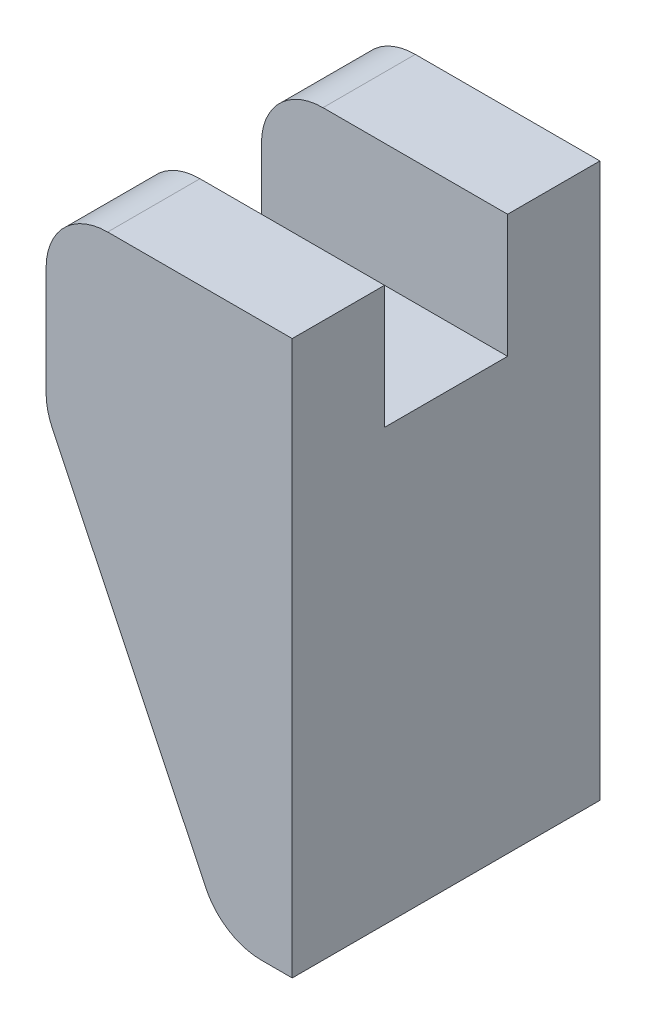
ISO-10303-21;
HEADER;
FILE_DESCRIPTION(('STEP AP214'),'2;1');
FILE_NAME('part.step','',(''),(''),'','','');
FILE_SCHEMA(('AUTOMOTIVE_DESIGN { 1 0 10303 214 1 1 1 1 }'));
ENDSEC;
DATA;
#1=APPLICATION_CONTEXT('core data for automotive mechanical design processes');
#2=APPLICATION_PROTOCOL_DEFINITION('international standard','automotive_design',2000,#1);
#3=PRODUCT_CONTEXT('',#1,'mechanical');
#4=PRODUCT('Part','Part','',(#3));
#5=PRODUCT_RELATED_PRODUCT_CATEGORY('part','',(#4));
#6=PRODUCT_DEFINITION_FORMATION('','',#4);
#7=PRODUCT_DEFINITION_CONTEXT('part definition',#1,'design');
#8=PRODUCT_DEFINITION('design','',#6,#7);
#9=PRODUCT_DEFINITION_SHAPE('','',#8);
#10=(LENGTH_UNIT() NAMED_UNIT(*) SI_UNIT(.MILLI.,.METRE.));
#11=(NAMED_UNIT(*) PLANE_ANGLE_UNIT() SI_UNIT($,.RADIAN.));
#12=(NAMED_UNIT(*) SI_UNIT($,.STERADIAN.) SOLID_ANGLE_UNIT());
#13=UNCERTAINTY_MEASURE_WITH_UNIT(LENGTH_MEASURE(1.E-05),#10,'distance_accuracy_value','');
#14=(GEOMETRIC_REPRESENTATION_CONTEXT(3) GLOBAL_UNCERTAINTY_ASSIGNED_CONTEXT((#13)) GLOBAL_UNIT_ASSIGNED_CONTEXT((#10,
#11,#12)) REPRESENTATION_CONTEXT('',''));
#15=CARTESIAN_POINT('',(0.,0.,0.));
#16=DIRECTION('',(0.,0.,1.));
#17=DIRECTION('',(1.,0.,0.));
#18=AXIS2_PLACEMENT_3D('',#15,#16,#17);
#19=CARTESIAN_POINT('',(0.,45.,25.));
#20=DIRECTION('',(0.,-1.,0.));
#21=DIRECTION('',(1.,0.,0.));
#22=AXIS2_PLACEMENT_3D('',#19,#20,#21);
#23=PLANE('',#22);
#24=DIRECTION('',(1.,0.,0.));
#25=VECTOR('',#24,1.);
#26=CARTESIAN_POINT('',(-40.,45.,10.));
#27=LINE('',#26,#25);
#28=CARTESIAN_POINT('',(-30.,45.,10.));
#29=VERTEX_POINT('',#28);
#30=CARTESIAN_POINT('',(0.,45.,10.));
#31=VERTEX_POINT('',#30);
#32=EDGE_CURVE('E157',#29,#31,#27,.T.);
#33=ORIENTED_EDGE('',*,*,#32,.F.);
#34=DIRECTION('',(0.,0.,-1.));
#35=VECTOR('',#34,1.);
#36=CARTESIAN_POINT('',(-30.,45.,25.));
#37=LINE('',#36,#35);
#38=CARTESIAN_POINT('',(-30.,45.,25.));
#39=VERTEX_POINT('',#38);
#40=EDGE_CURVE('E207',#29,#39,#37,.F.);
#41=ORIENTED_EDGE('',*,*,#40,.T.);
#42=DIRECTION('',(-1.,0.,0.));
#43=VECTOR('',#42,1.);
#44=CARTESIAN_POINT('',(0.,45.,25.));
#45=LINE('',#44,#43);
#46=CARTESIAN_POINT('',(0.,45.,25.));
#47=VERTEX_POINT('',#46);
#48=EDGE_CURVE('E172',#47,#39,#45,.T.);
#49=ORIENTED_EDGE('',*,*,#48,.F.);
#50=DIRECTION('',(0.,0.,-1.));
#51=VECTOR('',#50,1.);
#52=CARTESIAN_POINT('',(0.,45.,25.));
#53=LINE('',#52,#51);
#54=EDGE_CURVE('E196',#47,#31,#53,.T.);
#55=ORIENTED_EDGE('',*,*,#54,.T.);
#56=EDGE_LOOP('',(#33,#41,#49,#55));
#57=FACE_BOUND('',#56,.T.);
#58=ADVANCED_FACE('F40',(#57),#23,.F.);
#59=CARTESIAN_POINT('',(0.,-45.,25.));
#60=DIRECTION('',(-1.,0.,0.));
#61=DIRECTION('',(0.,-1.,0.));
#62=AXIS2_PLACEMENT_3D('',#59,#60,#61);
#63=PLANE('',#62);
#64=DIRECTION('',(0.,0.,-1.));
#65=VECTOR('',#64,1.);
#66=CARTESIAN_POINT('',(0.,25.,10.));
#67=LINE('',#66,#65);
#68=CARTESIAN_POINT('',(0.,25.,10.));
#69=VERTEX_POINT('',#68);
#70=CARTESIAN_POINT('',(0.,25.,-10.));
#71=VERTEX_POINT('',#70);
#72=EDGE_CURVE('E148',#69,#71,#67,.T.);
#73=ORIENTED_EDGE('',*,*,#72,.F.);
#74=DIRECTION('',(0.,1.,0.));
#75=VECTOR('',#74,1.);
#76=CARTESIAN_POINT('',(0.,25.,10.));
#77=LINE('',#76,#75);
#78=EDGE_CURVE('E186',#69,#31,#77,.T.);
#79=ORIENTED_EDGE('',*,*,#78,.T.);
#80=ORIENTED_EDGE('',*,*,#54,.F.);
#81=DIRECTION('',(0.,1.,0.));
#82=VECTOR('',#81,1.);
#83=CARTESIAN_POINT('',(0.,-45.,25.));
#84=LINE('',#83,#82);
#85=CARTESIAN_POINT('',(0.,-45.,25.));
#86=VERTEX_POINT('',#85);
#87=EDGE_CURVE('E169',#86,#47,#84,.T.);
#88=ORIENTED_EDGE('',*,*,#87,.F.);
#89=DIRECTION('',(0.,0.,-1.));
#90=VECTOR('',#89,1.);
#91=CARTESIAN_POINT('',(0.,-45.,25.));
#92=LINE('',#91,#90);
#93=CARTESIAN_POINT('',(0.,-45.,-25.));
#94=VERTEX_POINT('',#93);
#95=EDGE_CURVE('E182',#86,#94,#92,.T.);
#96=ORIENTED_EDGE('',*,*,#95,.T.);
#97=DIRECTION('',(0.,1.,0.));
#98=VECTOR('',#97,1.);
#99=CARTESIAN_POINT('',(0.,-45.,-25.));
#100=LINE('',#99,#98);
#101=CARTESIAN_POINT('',(0.,45.,-25.));
#102=VERTEX_POINT('',#101);
#103=EDGE_CURVE('E183',#94,#102,#100,.T.);
#104=ORIENTED_EDGE('',*,*,#103,.T.);
#105=CARTESIAN_POINT('',(0.,45.,-10.));
#106=VERTEX_POINT('',#105);
#107=EDGE_CURVE('E162',#106,#102,#53,.T.);
#108=ORIENTED_EDGE('',*,*,#107,.F.);
#109=DIRECTION('',(0.,1.,0.));
#110=VECTOR('',#109,1.);
#111=CARTESIAN_POINT('',(0.,25.,-10.));
#112=LINE('',#111,#110);
#113=EDGE_CURVE('E141',#71,#106,#112,.T.);
#114=ORIENTED_EDGE('',*,*,#113,.F.);
#115=EDGE_LOOP('',(#73,#79,#80,#88,#96,#104,#108,#114));
#116=FACE_BOUND('',#115,.T.);
#117=ADVANCED_FACE('F160',(#116),#63,.F.);
#118=DIRECTION('',(-1.,0.,0.));
#119=VECTOR('',#118,1.);
#120=CARTESIAN_POINT('',(0.,45.,-25.));
#121=LINE('',#120,#119);
#122=CARTESIAN_POINT('',(-30.,45.,-25.));
#123=VERTEX_POINT('',#122);
#124=EDGE_CURVE('E185',#102,#123,#121,.T.);
#125=ORIENTED_EDGE('',*,*,#124,.T.);
#126=DIRECTION('',(0.,0.,-1.));
#127=VECTOR('',#126,1.);
#128=CARTESIAN_POINT('',(-30.,45.,25.));
#129=LINE('',#128,#127);
#130=CARTESIAN_POINT('',(-30.,45.,-10.));
#131=VERTEX_POINT('',#130);
#132=EDGE_CURVE('E213',#123,#131,#129,.F.);
#133=ORIENTED_EDGE('',*,*,#132,.T.);
#134=DIRECTION('',(-1.,0.,0.));
#135=VECTOR('',#134,1.);
#136=CARTESIAN_POINT('',(-40.,45.,-10.));
#137=LINE('',#136,#135);
#138=EDGE_CURVE('E259',#106,#131,#137,.T.);
#139=ORIENTED_EDGE('',*,*,#138,.F.);
#140=ORIENTED_EDGE('',*,*,#107,.T.);
#141=EDGE_LOOP('',(#125,#133,#139,#140));
#142=FACE_BOUND('',#141,.T.);
#143=ADVANCED_FACE('F258',(#142),#23,.F.);
#144=CARTESIAN_POINT('',(-40.,45.,25.));
#145=DIRECTION('',(1.,0.,0.));
#146=DIRECTION('',(0.,0.,-1.));
#147=AXIS2_PLACEMENT_3D('',#144,#145,#146);
#148=PLANE('',#147);
#149=DIRECTION('',(0.,-1.,0.));
#150=VECTOR('',#149,1.);
#151=CARTESIAN_POINT('',(-40.,45.,-25.));
#152=LINE('',#151,#150);
#153=CARTESIAN_POINT('',(-40.,35.,-25.));
#154=VERTEX_POINT('',#153);
#155=CARTESIAN_POINT('',(-40.,17.2659587703308,-25.));
#156=VERTEX_POINT('',#155);
#157=EDGE_CURVE('E189',#154,#156,#152,.T.);
#158=ORIENTED_EDGE('',*,*,#157,.T.);
#159=DIRECTION('',(0.,0.,-1.));
#160=VECTOR('',#159,1.);
#161=CARTESIAN_POINT('',(-40.,17.2659587703308,25.));
#162=LINE('',#161,#160);
#163=CARTESIAN_POINT('',(-40.,17.2659587703308,25.));
#164=VERTEX_POINT('',#163);
#165=EDGE_CURVE('E11',#156,#164,#162,.F.);
#166=ORIENTED_EDGE('',*,*,#165,.T.);
#167=DIRECTION('',(0.,-1.,0.));
#168=VECTOR('',#167,1.);
#169=CARTESIAN_POINT('',(-40.,45.,25.));
#170=LINE('',#169,#168);
#171=CARTESIAN_POINT('',(-40.,35.,25.));
#172=VERTEX_POINT('',#171);
#173=EDGE_CURVE('E176',#172,#164,#170,.T.);
#174=ORIENTED_EDGE('',*,*,#173,.F.);
#175=DIRECTION('',(0.,0.,-1.));
#176=VECTOR('',#175,1.);
#177=CARTESIAN_POINT('',(-40.,35.,25.));
#178=LINE('',#177,#176);
#179=CARTESIAN_POINT('',(-40.,35.,10.));
#180=VERTEX_POINT('',#179);
#181=EDGE_CURVE('E202',#172,#180,#178,.T.);
#182=ORIENTED_EDGE('',*,*,#181,.T.);
#183=DIRECTION('',(0.,1.,0.));
#184=VECTOR('',#183,1.);
#185=CARTESIAN_POINT('',(-40.,25.,10.));
#186=LINE('',#185,#184);
#187=CARTESIAN_POINT('',(-40.,25.,10.));
#188=VERTEX_POINT('',#187);
#189=EDGE_CURVE('E164',#188,#180,#186,.T.);
#190=ORIENTED_EDGE('',*,*,#189,.F.);
#191=DIRECTION('',(0.,0.,1.));
#192=VECTOR('',#191,1.);
#193=CARTESIAN_POINT('',(-40.,25.,10.));
#194=LINE('',#193,#192);
#195=CARTESIAN_POINT('',(-40.,25.,-9.99999999999999));
#196=VERTEX_POINT('',#195);
#197=EDGE_CURVE('E147',#196,#188,#194,.T.);
#198=ORIENTED_EDGE('',*,*,#197,.F.);
#199=DIRECTION('',(0.,1.,0.));
#200=VECTOR('',#199,1.);
#201=CARTESIAN_POINT('',(-40.,25.,-10.));
#202=LINE('',#201,#200);
#203=CARTESIAN_POINT('',(-40.,35.,-10.));
#204=VERTEX_POINT('',#203);
#205=EDGE_CURVE('E144',#196,#204,#202,.T.);
#206=ORIENTED_EDGE('',*,*,#205,.T.);
#207=DIRECTION('',(0.,0.,-1.));
#208=VECTOR('',#207,1.);
#209=CARTESIAN_POINT('',(-40.,35.,25.));
#210=LINE('',#209,#208);
#211=EDGE_CURVE('E199',#204,#154,#210,.T.);
#212=ORIENTED_EDGE('',*,*,#211,.T.);
#213=EDGE_LOOP('',(#158,#166,#174,#182,#190,#198,#206,#212));
#214=FACE_BOUND('',#213,.T.);
#215=ADVANCED_FACE('F250',(#214),#148,.F.);
#216=CARTESIAN_POINT('',(-40.,15.,25.));
#217=DIRECTION('',(0.902323865681701,0.431058744745113,0.));
#218=DIRECTION('',(-0.431058744745113,0.902323865681701,0.));
#219=AXIS2_PLACEMENT_3D('',#216,#217,#218);
#220=PLANE('',#219);
#221=DIRECTION('',(0.431058744745113,-0.9023238656817,0.));
#222=VECTOR('',#221,1.);
#223=CARTESIAN_POINT('',(-40.,15.,-25.));
#224=LINE('',#223,#222);
#225=CARTESIAN_POINT('',(-39.023238656817,12.9553713228797,-25.));
#226=VERTEX_POINT('',#225);
#227=CARTESIAN_POINT('',(-14.0547107952409,-39.3105874474511,-25.));
#228=VERTEX_POINT('',#227);
#229=EDGE_CURVE('E191',#226,#228,#224,.T.);
#230=ORIENTED_EDGE('',*,*,#229,.T.);
#231=DIRECTION('',(0.,0.,-1.));
#232=VECTOR('',#231,1.);
#233=CARTESIAN_POINT('',(-14.0547107952409,-39.3105874474511,25.));
#234=LINE('',#233,#232);
#235=CARTESIAN_POINT('',(-14.0547107952409,-39.3105874474511,25.));
#236=VERTEX_POINT('',#235);
#237=EDGE_CURVE('E61',#228,#236,#234,.F.);
#238=ORIENTED_EDGE('',*,*,#237,.T.);
#239=DIRECTION('',(0.431058744745113,-0.9023238656817,0.));
#240=VECTOR('',#239,1.);
#241=CARTESIAN_POINT('',(-40.,15.,25.));
#242=LINE('',#241,#240);
#243=CARTESIAN_POINT('',(-39.023238656817,12.9553713228797,25.));
#244=VERTEX_POINT('',#243);
#245=EDGE_CURVE('E178',#244,#236,#242,.T.);
#246=ORIENTED_EDGE('',*,*,#245,.F.);
#247=DIRECTION('',(0.,0.,-1.));
#248=VECTOR('',#247,1.);
#249=CARTESIAN_POINT('',(-39.023238656817,12.9553713228797,25.));
#250=LINE('',#249,#248);
#251=EDGE_CURVE('E224',#244,#226,#250,.T.);
#252=ORIENTED_EDGE('',*,*,#251,.T.);
#253=EDGE_LOOP('',(#230,#238,#246,#252));
#254=FACE_BOUND('',#253,.T.);
#255=ADVANCED_FACE('F245',(#254),#220,.F.);
#256=CARTESIAN_POINT('',(-11.3367609254499,-45.,25.));
#257=DIRECTION('',(0.,1.,0.));
#258=DIRECTION('',(-1.,0.,0.));
#259=AXIS2_PLACEMENT_3D('',#256,#257,#258);
#260=PLANE('',#259);
#261=DIRECTION('',(1.,0.,0.));
#262=VECTOR('',#261,1.);
#263=CARTESIAN_POINT('',(-11.3367609254499,-45.,25.));
#264=LINE('',#263,#262);
#265=CARTESIAN_POINT('',(-5.03147213842384,-45.,25.));
#266=VERTEX_POINT('',#265);
#267=EDGE_CURVE('E180',#266,#86,#264,.T.);
#268=ORIENTED_EDGE('',*,*,#267,.F.);
#269=DIRECTION('',(0.,0.,-1.));
#270=VECTOR('',#269,1.);
#271=CARTESIAN_POINT('',(-5.03147213842384,-45.,25.));
#272=LINE('',#271,#270);
#273=CARTESIAN_POINT('',(-5.03147213842384,-45.,-25.));
#274=VERTEX_POINT('',#273);
#275=EDGE_CURVE('E217',#266,#274,#272,.T.);
#276=ORIENTED_EDGE('',*,*,#275,.T.);
#277=DIRECTION('',(1.,0.,0.));
#278=VECTOR('',#277,1.);
#279=CARTESIAN_POINT('',(-11.3367609254499,-45.,-25.));
#280=LINE('',#279,#278);
#281=EDGE_CURVE('E173',#274,#94,#280,.T.);
#282=ORIENTED_EDGE('',*,*,#281,.T.);
#283=ORIENTED_EDGE('',*,*,#95,.F.);
#284=EDGE_LOOP('',(#268,#276,#282,#283));
#285=FACE_BOUND('',#284,.T.);
#286=ADVANCED_FACE('F237',(#285),#260,.F.);
#287=CARTESIAN_POINT('',(0.,0.,25.));
#288=DIRECTION('',(0.,0.,1.));
#289=DIRECTION('',(1.,0.,0.));
#290=AXIS2_PLACEMENT_3D('',#287,#288,#289);
#291=PLANE('',#290);
#292=ORIENTED_EDGE('',*,*,#245,.T.);
#293=CARTESIAN_POINT('',(-5.03147213842385,-35.,25.));
#294=DIRECTION('',(0.,0.,1.));
#295=DIRECTION('',(1.,0.,0.));
#296=AXIS2_PLACEMENT_3D('',#293,#294,#295);
#297=CIRCLE('',#296,10.);
#298=EDGE_CURVE('E48',#236,#266,#297,.T.);
#299=ORIENTED_EDGE('',*,*,#298,.T.);
#300=ORIENTED_EDGE('',*,*,#267,.T.);
#301=ORIENTED_EDGE('',*,*,#87,.T.);
#302=ORIENTED_EDGE('',*,*,#48,.T.);
#303=CARTESIAN_POINT('',(-30.,35.,25.));
#304=DIRECTION('',(0.,0.,1.));
#305=DIRECTION('',(1.,0.,0.));
#306=AXIS2_PLACEMENT_3D('',#303,#304,#305);
#307=CIRCLE('',#306,10.);
#308=EDGE_CURVE('E209',#39,#172,#307,.T.);
#309=ORIENTED_EDGE('',*,*,#308,.T.);
#310=ORIENTED_EDGE('',*,*,#173,.T.);
#311=CARTESIAN_POINT('',(-30.,17.2659587703308,25.));
#312=DIRECTION('',(0.,0.,1.));
#313=DIRECTION('',(1.,0.,0.));
#314=AXIS2_PLACEMENT_3D('',#311,#312,#313);
#315=CIRCLE('',#314,10.);
#316=EDGE_CURVE('E228',#164,#244,#315,.T.);
#317=ORIENTED_EDGE('',*,*,#316,.T.);
#318=EDGE_LOOP('',(#292,#299,#300,#301,#302,#309,#310,#317));
#319=FACE_BOUND('',#318,.T.);
#320=ADVANCED_FACE('F232',(#319),#291,.T.);
#321=CARTESIAN_POINT('',(0.,0.,-25.));
#322=DIRECTION('',(0.,0.,1.));
#323=DIRECTION('',(1.,0.,0.));
#324=AXIS2_PLACEMENT_3D('',#321,#322,#323);
#325=PLANE('',#324);
#326=ORIENTED_EDGE('',*,*,#281,.F.);
#327=CARTESIAN_POINT('',(-5.03147213842385,-35.,-25.));
#328=DIRECTION('',(0.,0.,1.));
#329=DIRECTION('',(1.,0.,0.));
#330=AXIS2_PLACEMENT_3D('',#327,#328,#329);
#331=CIRCLE('',#330,10.);
#332=EDGE_CURVE('E222',#274,#228,#331,.F.);
#333=ORIENTED_EDGE('',*,*,#332,.T.);
#334=ORIENTED_EDGE('',*,*,#229,.F.);
#335=CARTESIAN_POINT('',(-30.,17.2659587703308,-25.));
#336=DIRECTION('',(0.,0.,1.));
#337=DIRECTION('',(1.,0.,0.));
#338=AXIS2_PLACEMENT_3D('',#335,#336,#337);
#339=CIRCLE('',#338,10.);
#340=EDGE_CURVE('E220',#226,#156,#339,.F.);
#341=ORIENTED_EDGE('',*,*,#340,.T.);
#342=ORIENTED_EDGE('',*,*,#157,.F.);
#343=CARTESIAN_POINT('',(-30.,35.,-25.));
#344=DIRECTION('',(0.,0.,1.));
#345=DIRECTION('',(1.,0.,0.));
#346=AXIS2_PLACEMENT_3D('',#343,#344,#345);
#347=CIRCLE('',#346,10.);
#348=EDGE_CURVE('E211',#154,#123,#347,.F.);
#349=ORIENTED_EDGE('',*,*,#348,.T.);
#350=ORIENTED_EDGE('',*,*,#124,.F.);
#351=ORIENTED_EDGE('',*,*,#103,.F.);
#352=EDGE_LOOP('',(#326,#333,#334,#341,#342,#349,#350,#351));
#353=FACE_BOUND('',#352,.T.);
#354=ADVANCED_FACE('F243',(#353),#325,.F.);
#355=CARTESIAN_POINT('',(-40.,25.,10.));
#356=DIRECTION('',(0.,0.,1.));
#357=DIRECTION('',(1.,0.,0.));
#358=AXIS2_PLACEMENT_3D('',#355,#356,#357);
#359=PLANE('',#358);
#360=ORIENTED_EDGE('',*,*,#189,.T.);
#361=CARTESIAN_POINT('',(-30.,35.,10.));
#362=DIRECTION('',(0.,0.,1.));
#363=DIRECTION('',(1.,0.,0.));
#364=AXIS2_PLACEMENT_3D('',#361,#362,#363);
#365=CIRCLE('',#364,10.);
#366=EDGE_CURVE('E205',#180,#29,#365,.F.);
#367=ORIENTED_EDGE('',*,*,#366,.T.);
#368=ORIENTED_EDGE('',*,*,#32,.T.);
#369=ORIENTED_EDGE('',*,*,#78,.F.);
#370=DIRECTION('',(1.,0.,0.));
#371=VECTOR('',#370,1.);
#372=CARTESIAN_POINT('',(-40.,25.,10.));
#373=LINE('',#372,#371);
#374=EDGE_CURVE('E154',#188,#69,#373,.T.);
#375=ORIENTED_EDGE('',*,*,#374,.F.);
#376=EDGE_LOOP('',(#360,#367,#368,#369,#375));
#377=FACE_BOUND('',#376,.T.);
#378=ADVANCED_FACE('F267',(#377),#359,.F.);
#379=CARTESIAN_POINT('',(-40.,25.,-10.));
#380=DIRECTION('',(0.,0.,-1.));
#381=DIRECTION('',(-1.,0.,0.));
#382=AXIS2_PLACEMENT_3D('',#379,#380,#381);
#383=PLANE('',#382);
#384=ORIENTED_EDGE('',*,*,#138,.T.);
#385=CARTESIAN_POINT('',(-30.,35.,-10.));
#386=DIRECTION('',(0.,0.,-1.));
#387=DIRECTION('',(-1.,0.,0.));
#388=AXIS2_PLACEMENT_3D('',#385,#386,#387);
#389=CIRCLE('',#388,10.);
#390=EDGE_CURVE('E215',#131,#204,#389,.F.);
#391=ORIENTED_EDGE('',*,*,#390,.T.);
#392=ORIENTED_EDGE('',*,*,#205,.F.);
#393=DIRECTION('',(-1.,0.,0.));
#394=VECTOR('',#393,1.);
#395=CARTESIAN_POINT('',(-40.,25.,-10.));
#396=LINE('',#395,#394);
#397=EDGE_CURVE('E136',#71,#196,#396,.T.);
#398=ORIENTED_EDGE('',*,*,#397,.F.);
#399=ORIENTED_EDGE('',*,*,#113,.T.);
#400=EDGE_LOOP('',(#384,#391,#392,#398,#399));
#401=FACE_BOUND('',#400,.T.);
#402=ADVANCED_FACE('F139',(#401),#383,.F.);
#403=CARTESIAN_POINT('',(0.,25.,0.));
#404=DIRECTION('',(0.,-1.,0.));
#405=DIRECTION('',(1.,0.,0.));
#406=AXIS2_PLACEMENT_3D('',#403,#404,#405);
#407=PLANE('',#406);
#408=ORIENTED_EDGE('',*,*,#72,.T.);
#409=ORIENTED_EDGE('',*,*,#397,.T.);
#410=ORIENTED_EDGE('',*,*,#197,.T.);
#411=ORIENTED_EDGE('',*,*,#374,.T.);
#412=EDGE_LOOP('',(#408,#409,#410,#411));
#413=FACE_BOUND('',#412,.T.);
#414=ADVANCED_FACE('F152',(#413),#407,.F.);
#415=CARTESIAN_POINT('',(-30.,35.,25.));
#416=DIRECTION('',(0.,0.,-1.));
#417=DIRECTION('',(-1.,0.,0.));
#418=AXIS2_PLACEMENT_3D('',#415,#416,#417);
#419=CYLINDRICAL_SURFACE('',#418,10.);
#420=ORIENTED_EDGE('',*,*,#308,.F.);
#421=ORIENTED_EDGE('',*,*,#40,.F.);
#422=ORIENTED_EDGE('',*,*,#366,.F.);
#423=ORIENTED_EDGE('',*,*,#181,.F.);
#424=EDGE_LOOP('',(#420,#421,#422,#423));
#425=FACE_BOUND('',#424,.T.);
#426=ADVANCED_FACE('F272',(#425),#419,.T.);
#427=CARTESIAN_POINT('',(-30.,35.,25.));
#428=DIRECTION('',(0.,0.,-1.));
#429=DIRECTION('',(-1.,0.,0.));
#430=AXIS2_PLACEMENT_3D('',#427,#428,#429);
#431=CYLINDRICAL_SURFACE('',#430,10.);
#432=ORIENTED_EDGE('',*,*,#390,.F.);
#433=ORIENTED_EDGE('',*,*,#132,.F.);
#434=ORIENTED_EDGE('',*,*,#348,.F.);
#435=ORIENTED_EDGE('',*,*,#211,.F.);
#436=EDGE_LOOP('',(#432,#433,#434,#435));
#437=FACE_BOUND('',#436,.T.);
#438=ADVANCED_FACE('F254',(#437),#431,.T.);
#439=CARTESIAN_POINT('',(-5.03147213842385,-35.,25.));
#440=DIRECTION('',(0.,0.,-1.));
#441=DIRECTION('',(-1.,0.,0.));
#442=AXIS2_PLACEMENT_3D('',#439,#440,#441);
#443=CYLINDRICAL_SURFACE('',#442,10.);
#444=ORIENTED_EDGE('',*,*,#298,.F.);
#445=ORIENTED_EDGE('',*,*,#237,.F.);
#446=ORIENTED_EDGE('',*,*,#332,.F.);
#447=ORIENTED_EDGE('',*,*,#275,.F.);
#448=EDGE_LOOP('',(#444,#445,#446,#447));
#449=FACE_BOUND('',#448,.T.);
#450=ADVANCED_FACE('F240',(#449),#443,.T.);
#451=CARTESIAN_POINT('',(-30.,17.2659587703308,25.));
#452=DIRECTION('',(0.,0.,-1.));
#453=DIRECTION('',(-1.,0.,0.));
#454=AXIS2_PLACEMENT_3D('',#451,#452,#453);
#455=CYLINDRICAL_SURFACE('',#454,10.);
#456=ORIENTED_EDGE('',*,*,#316,.F.);
#457=ORIENTED_EDGE('',*,*,#165,.F.);
#458=ORIENTED_EDGE('',*,*,#340,.F.);
#459=ORIENTED_EDGE('',*,*,#251,.F.);
#460=EDGE_LOOP('',(#456,#457,#458,#459));
#461=FACE_BOUND('',#460,.T.);
#462=ADVANCED_FACE('F42',(#461),#455,.T.);
#463=CLOSED_SHELL('',(#58,#117,#143,#215,#255,#286,#320,#354,#378,#402,#414,#426,#438,#450,#462));
#464=MANIFOLD_SOLID_BREP('B2',#463);
#465=ADVANCED_BREP_SHAPE_REPRESENTATION('',(#18,#464),#14);
#466=SHAPE_DEFINITION_REPRESENTATION(#9,#465);
ENDSEC;
END-ISO-10303-21;
